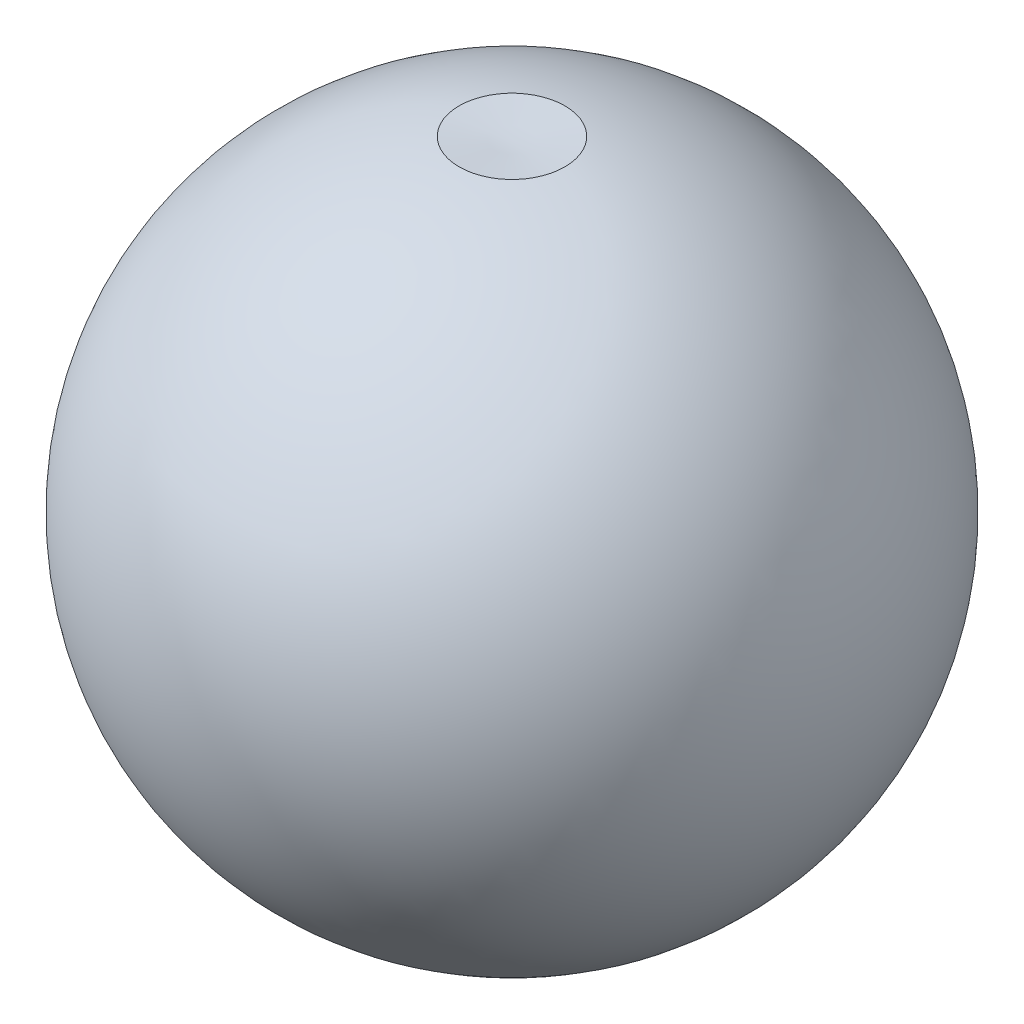
ISO-10303-21;
HEADER;
FILE_DESCRIPTION(('STEP AP214'),'2;1');
FILE_NAME('part.step','',(''),(''),'','','');
FILE_SCHEMA(('AUTOMOTIVE_DESIGN { 1 0 10303 214 1 1 1 1 }'));
ENDSEC;
DATA;
#1=APPLICATION_CONTEXT('core data for automotive mechanical design processes');
#2=APPLICATION_PROTOCOL_DEFINITION('international standard','automotive_design',2000,#1);
#3=PRODUCT_CONTEXT('',#1,'mechanical');
#4=PRODUCT('Part','Part','',(#3));
#5=PRODUCT_RELATED_PRODUCT_CATEGORY('part','',(#4));
#6=PRODUCT_DEFINITION_FORMATION('','',#4);
#7=PRODUCT_DEFINITION_CONTEXT('part definition',#1,'design');
#8=PRODUCT_DEFINITION('design','',#6,#7);
#9=PRODUCT_DEFINITION_SHAPE('','',#8);
#10=(LENGTH_UNIT() NAMED_UNIT(*) SI_UNIT(.MILLI.,.METRE.));
#11=(NAMED_UNIT(*) PLANE_ANGLE_UNIT() SI_UNIT($,.RADIAN.));
#12=(NAMED_UNIT(*) SI_UNIT($,.STERADIAN.) SOLID_ANGLE_UNIT());
#13=UNCERTAINTY_MEASURE_WITH_UNIT(LENGTH_MEASURE(1.E-05),#10,'distance_accuracy_value','');
#14=(GEOMETRIC_REPRESENTATION_CONTEXT(3) GLOBAL_UNCERTAINTY_ASSIGNED_CONTEXT((#13)) GLOBAL_UNIT_ASSIGNED_CONTEXT((#10,
#11,#12)) REPRESENTATION_CONTEXT('',''));
#15=CARTESIAN_POINT('',(0.,0.,0.));
#16=DIRECTION('',(0.,0.,1.));
#17=DIRECTION('',(1.,0.,0.));
#18=AXIS2_PLACEMENT_3D('',#15,#16,#17);
#19=CARTESIAN_POINT('',(0.,-30.,0.));
#20=DIRECTION('',(0.,1.,0.));
#21=DIRECTION('',(-1.,0.,0.));
#22=AXIS2_PLACEMENT_3D('',#19,#20,#21);
#23=PLANE('',#22);
#24=CARTESIAN_POINT('',(0.,-30.,0.));
#25=DIRECTION('',(0.,1.,0.));
#26=DIRECTION('',(-1.,0.,0.));
#27=AXIS2_PLACEMENT_3D('',#24,#25,#26);
#28=CIRCLE('',#27,4.87533777749147);
#29=CARTESIAN_POINT('',(4.87533777749144,-30.,0.));
#30=VERTEX_POINT('',#29);
#31=EDGE_CURVE('E11',#30,#30,#28,.T.);
#32=ORIENTED_EDGE('',*,*,#31,.F.);
#33=EDGE_LOOP('',(#32));
#34=FACE_BOUND('',#33,.T.);
#35=ADVANCED_FACE('F32',(#34),#23,.F.);
#36=CARTESIAN_POINT('',(0.,0.,0.));
#37=DIRECTION('',(0.,1.,0.));
#38=DIRECTION('',(1.,0.,0.));
#39=AXIS2_PLACEMENT_3D('',#36,#37,#38);
#40=SPHERICAL_SURFACE('',#39,30.3935670569388);
#41=CARTESIAN_POINT('',(0.,30.,0.));
#42=DIRECTION('',(0.,1.,0.));
#43=DIRECTION('',(-1.,0.,0.));
#44=AXIS2_PLACEMENT_3D('',#41,#42,#43);
#45=CIRCLE('',#44,4.8753377774915);
#46=CARTESIAN_POINT('',(4.87533777749148,30.,0.));
#47=VERTEX_POINT('',#46);
#48=EDGE_CURVE('E38',#47,#47,#45,.T.);
#49=CARTESIAN_POINT('',(4.87533777749148,30.,0.));
#50=CARTESIAN_POINT('',(5.31586836795734,29.9284157533238,0.));
#51=CARTESIAN_POINT('',(5.75481939059711,29.8471150206072,0.));
#52=CARTESIAN_POINT('',(6.62871671181679,29.6652677864923,0.));
#53=CARTESIAN_POINT('',(7.0636630103967,29.5647212850941,0.));
#54=CARTESIAN_POINT('',(7.92870529508897,29.3445697170153,0.));
#55=CARTESIAN_POINT('',(8.35880128120133,29.2249646503347,0.));
#56=CARTESIAN_POINT('',(9.21330884594772,28.9669301414478,0.));
#57=CARTESIAN_POINT('',(9.63772042458175,28.8285006992416,0.));
#58=CARTESIAN_POINT('',(10.4800355511774,28.5330854737222,0.));
#59=CARTESIAN_POINT('',(10.897939099139,28.3760996904091,0.));
#60=CARTESIAN_POINT('',(11.7264273185159,28.0438765412256,0.));
#61=CARTESIAN_POINT('',(12.1370119899311,27.8686391753553,0.));
#62=CARTESIAN_POINT('',(12.9500657714383,27.5002528414943,0.));
#63=CARTESIAN_POINT('',(13.3525348815302,27.3071038735037,0.));
#64=CARTESIAN_POINT('',(14.1485766133436,26.9032691221238,0.));
#65=CARTESIAN_POINT('',(14.5421492350649,26.6925833387345,0.));
#66=CARTESIAN_POINT('',(15.3196343224792,26.2540837569471,0.));
#67=CARTESIAN_POINT('',(15.7035467881722,26.0262699585489,0.));
#68=CARTESIAN_POINT('',(16.4609666406872,25.5539563851118,0.));
#69=CARTESIAN_POINT('',(16.8344740275092,25.3094566100728,0.));
#70=CARTESIAN_POINT('',(17.5703589886864,24.8042454972973,0.));
#71=CARTESIAN_POINT('',(17.9327365630416,24.5435341595608,0.));
#72=CARTESIAN_POINT('',(18.6456587614309,24.0064057916395,0.));
#73=CARTESIAN_POINT('',(18.9962033854651,23.7299887614549,0.));
#74=CARTESIAN_POINT('',(19.6847795053612,23.1619853532926,0.));
#75=CARTESIAN_POINT('',(20.0228110012231,22.8703989753151,0.));
#76=CARTESIAN_POINT('',(20.6857049667251,22.2726226500242,0.));
#77=CARTESIAN_POINT('',(21.0105674363651,21.966432702711,0.));
#78=CARTESIAN_POINT('',(21.6464930038397,21.3400433531777,0.));
#79=CARTESIAN_POINT('',(21.9575561016742,21.0198439509577,0.));
#80=CARTESIAN_POINT('',(22.5652793555097,20.3660569892306,0.));
#81=CARTESIAN_POINT('',(22.8619395115106,20.0324694297235,0.));
#82=CARTESIAN_POINT('',(23.4402812583412,19.3525534286987,0.));
#83=CARTESIAN_POINT('',(23.7219628491708,19.0062249871809,0.));
#84=CARTESIAN_POINT('',(24.2698009059192,18.3014992191301,0.));
#85=CARTESIAN_POINT('',(24.5359573718381,17.9431018925971,0.));
#86=CARTESIAN_POINT('',(25.0522287431393,17.2149337693238,0.));
#87=CARTESIAN_POINT('',(25.3023436485217,16.8451629725834,0.));
#88=CARTESIAN_POINT('',(25.7860465893014,16.0949653921703,0.));
#89=CARTESIAN_POINT('',(26.0196346246987,15.7145386084975,0.));
#90=CARTESIAN_POINT('',(26.4698305839056,14.9437672137957,0.));
#91=CARTESIAN_POINT('',(26.6864385077151,14.5534226027668,0.));
#92=CARTESIAN_POINT('',(27.1022539494343,13.7635729569452,0.));
#93=CARTESIAN_POINT('',(27.3014614673441,13.3640679221526,0.));
#94=CARTESIAN_POINT('',(27.6820895657595,12.5566726067876,0.));
#95=CARTESIAN_POINT('',(27.8635101462652,12.1487823262152,0.));
#96=CARTESIAN_POINT('',(28.2082123511803,11.3254079675524,0.));
#97=CARTESIAN_POINT('',(28.3714939755898,10.909923889462,0.));
#98=CARTESIAN_POINT('',(28.6796014454707,10.0721681186194,0.));
#99=CARTESIAN_POINT('',(28.8244272909423,9.64989642586709,0.));
#100=CARTESIAN_POINT('',(29.0953421907019,8.79938477887753,0.));
#101=CARTESIAN_POINT('',(29.22143124499,8.37114482464025,0.));
#102=CARTESIAN_POINT('',(29.4546279059946,7.50952758834968,0.));
#103=CARTESIAN_POINT('',(29.561735512711,7.0761503062964,0.));
#104=CARTESIAN_POINT('',(29.7567614527594,6.20509931623615,0.));
#105=CARTESIAN_POINT('',(29.8446797860912,5.76742560822918,0.));
#106=CARTESIAN_POINT('',(30.0011565873867,4.88863100467667,0.));
#107=CARTESIAN_POINT('',(30.0697150553502,4.44751010913112,0.));
#108=CARTESIAN_POINT('',(30.1873390987621,3.56267705765299,0.));
#109=CARTESIAN_POINT('',(30.2364046742105,3.11896490172041,0.));
#110=CARTESIAN_POINT('',(30.3149477284003,2.22981028456139,0.));
#111=CARTESIAN_POINT('',(30.3444252071419,1.78436782333496,0.));
#112=CARTESIAN_POINT('',(30.3837348714111,0.892616908072348,0.));
#113=CARTESIAN_POINT('',(30.3935670569388,0.446308454036166,0.));
#114=CARTESIAN_POINT('',(30.3935670569388,-0.446308454036199,0.));
#115=CARTESIAN_POINT('',(30.3837348714111,-0.892616908072381,0.));
#116=CARTESIAN_POINT('',(30.3444252071419,-1.78436782333499,0.));
#117=CARTESIAN_POINT('',(30.3149477284003,-2.22981028456142,0.));
#118=CARTESIAN_POINT('',(30.2364046742105,-3.11896490172044,0.));
#119=CARTESIAN_POINT('',(30.1873390987621,-3.56267705765302,0.));
#120=CARTESIAN_POINT('',(30.0697150553502,-4.44751010913116,0.));
#121=CARTESIAN_POINT('',(30.0011565873866,-4.88863100467671,0.));
#122=CARTESIAN_POINT('',(29.8446797860912,-5.76742560822922,0.));
#123=CARTESIAN_POINT('',(29.7567614527594,-6.20509931623618,0.));
#124=CARTESIAN_POINT('',(29.561735512711,-7.07615030629643,0.));
#125=CARTESIAN_POINT('',(29.4546279059946,-7.50952758834972,0.));
#126=CARTESIAN_POINT('',(29.22143124499,-8.37114482464028,0.));
#127=CARTESIAN_POINT('',(29.0953421907019,-8.79938477887756,0.));
#128=CARTESIAN_POINT('',(28.8244272909423,-9.64989642586712,0.));
#129=CARTESIAN_POINT('',(28.6796014454707,-10.0721681186194,0.));
#130=CARTESIAN_POINT('',(28.3714939755897,-10.9099238894621,0.));
#131=CARTESIAN_POINT('',(28.2082123511803,-11.3254079675525,0.));
#132=CARTESIAN_POINT('',(27.8635101462651,-12.1487823262152,0.));
#133=CARTESIAN_POINT('',(27.6820895657595,-12.5566726067876,0.));
#134=CARTESIAN_POINT('',(27.3014614673441,-13.3640679221526,0.));
#135=CARTESIAN_POINT('',(27.1022539494343,-13.7635729569452,0.));
#136=CARTESIAN_POINT('',(26.686438507715,-14.5534226027668,0.));
#137=CARTESIAN_POINT('',(26.4698305839056,-14.9437672137958,0.));
#138=CARTESIAN_POINT('',(26.0196346246987,-15.7145386084975,0.));
#139=CARTESIAN_POINT('',(25.7860465893013,-16.0949653921703,0.));
#140=CARTESIAN_POINT('',(25.3023436485216,-16.8451629725834,0.));
#141=CARTESIAN_POINT('',(25.0522287431393,-17.2149337693238,0.));
#142=CARTESIAN_POINT('',(24.5359573718381,-17.9431018925972,0.));
#143=CARTESIAN_POINT('',(24.2698009059192,-18.3014992191302,0.));
#144=CARTESIAN_POINT('',(23.7219628491708,-19.0062249871809,0.));
#145=CARTESIAN_POINT('',(23.4402812583412,-19.3525534286987,0.));
#146=CARTESIAN_POINT('',(22.8619395115106,-20.0324694297236,0.));
#147=CARTESIAN_POINT('',(22.5652793555096,-20.3660569892306,0.));
#148=CARTESIAN_POINT('',(21.9575561016742,-21.0198439509577,0.));
#149=CARTESIAN_POINT('',(21.6464930038397,-21.3400433531777,0.));
#150=CARTESIAN_POINT('',(21.0105674363651,-21.966432702711,0.));
#151=CARTESIAN_POINT('',(20.6857049667251,-22.2726226500242,0.));
#152=CARTESIAN_POINT('',(20.0228110012231,-22.8703989753151,0.));
#153=CARTESIAN_POINT('',(19.6847795053612,-23.1619853532926,0.));
#154=CARTESIAN_POINT('',(18.9962033854651,-23.7299887614549,0.));
#155=CARTESIAN_POINT('',(18.6456587614309,-24.0064057916395,0.));
#156=CARTESIAN_POINT('',(17.9327365630415,-24.5435341595608,0.));
#157=CARTESIAN_POINT('',(17.5703589886864,-24.8042454972973,0.));
#158=CARTESIAN_POINT('',(16.8344740275092,-25.3094566100729,0.));
#159=CARTESIAN_POINT('',(16.4609666406871,-25.5539563851118,0.));
#160=CARTESIAN_POINT('',(15.7035467881721,-26.0262699585489,0.));
#161=CARTESIAN_POINT('',(15.3196343224792,-26.2540837569471,0.));
#162=CARTESIAN_POINT('',(14.5421492350649,-26.6925833387345,0.));
#163=CARTESIAN_POINT('',(14.1485766133435,-26.9032691221238,0.));
#164=CARTESIAN_POINT('',(13.3525348815302,-27.3071038735037,0.));
#165=CARTESIAN_POINT('',(12.9500657714382,-27.5002528414943,0.));
#166=CARTESIAN_POINT('',(12.1370119899311,-27.8686391753553,0.));
#167=CARTESIAN_POINT('',(11.7264273185158,-28.0438765412257,0.));
#168=CARTESIAN_POINT('',(10.897939099139,-28.3760996904091,0.));
#169=CARTESIAN_POINT('',(10.4800355511774,-28.5330854737222,0.));
#170=CARTESIAN_POINT('',(9.63772042458171,-28.8285006992416,0.));
#171=CARTESIAN_POINT('',(9.21330884594769,-28.9669301414478,0.));
#172=CARTESIAN_POINT('',(8.3588012812013,-29.2249646503347,0.));
#173=CARTESIAN_POINT('',(7.92870529508894,-29.3445697170153,0.));
#174=CARTESIAN_POINT('',(7.06366301039666,-29.5647212850941,0.));
#175=CARTESIAN_POINT('',(6.62871671181675,-29.6652677864924,0.));
#176=CARTESIAN_POINT('',(5.75481939059708,-29.8471150206072,0.));
#177=CARTESIAN_POINT('',(5.3158683679573,-29.9284157533238,0.));
#178=CARTESIAN_POINT('',(4.87533777749144,-30.,0.));
#179=B_SPLINE_CURVE_WITH_KNOTS('',3,(#49,#50,#51,#52,#53,#54,#55,#56,#57,#58,#59,#60,#61,#62,
#63,#64,#65,#66,#67,#68,#69,#70,#71,#72,#73,#74,#75,#76,#77,#78,#79,#80,#81,#82,#83,#84,#85,#86,
#87,#88,#89,#90,#91,#92,#93,#94,#95,#96,#97,#98,#99,#100,#101,#102,#103,#104,#105,#106,#107,
#108,#109,#110,#111,#112,#113,#114,#115,#116,#117,#118,#119,#120,#121,#122,#123,#124,#125,#126,
#127,#128,#129,#130,#131,#132,#133,#134,#135,#136,#137,#138,#139,#140,#141,#142,#143,#144,#145,
#146,#147,#148,#149,#150,#151,#152,#153,#154,#155,#156,#157,#158,#159,#160,#161,#162,#163,#164,
#165,#166,#167,#168,#169,#170,#171,#172,#173,#174,#175,#176,#177,#178),.UNSPECIFIED.,.F.,.F.,(4,
2,2,2,2,2,2,2,2,2,2,2,2,2,2,2,2,2,2,2,2,2,2,2,2,2,2,2,2,2,2,2,2,2,2,2,2,2,2,2,2,2,2,2,2,2,2,2,2,
2,2,2,2,2,2,2,2,2,2,2,2,2,2,2,4),(0.,1.33881712614443,2.67763425228886,4.01645137843329,
5.35526850457771,6.69408563072214,8.03290275686657,9.37171988301101,10.7105370091554,
12.0493541352999,13.3881712614443,14.7269883875887,16.0658055137332,17.4046226398776,
18.743439766022,20.0822568921664,21.4210740183109,22.7598911444553,24.0987082705997,
25.4375253967442,26.7763425228886,28.115159649033,29.4539767751774,30.7927939013219,
32.1316110274663,33.4704281536107,34.8092452797552,36.1480624058996,37.486879532044,
38.8256966581884,40.1645137843329,41.5033309104773,42.8421480366217,44.1809651627662,
45.5197822889106,46.858599415055,48.1974165411994,49.5362336673439,50.8750507934883,
52.2138679196327,53.5526850457772,54.8915021719216,56.230319298066,57.5691364242104,
58.9079535503549,60.2467706764993,61.5855878026437,62.9244049287881,64.2632220549326,
65.602039181077,66.9408563072215,68.2796734333659,69.6184905595103,70.9573076856547,
72.2961248117992,73.6349419379436,74.973759064088,76.3125761902325,77.6513933163769,
78.9902104425213,80.3290275686658,81.6678446948102,83.0066618209546,84.3454789470991,
85.6842960732435),.UNSPECIFIED.);
#180=EDGE_CURVE('BSEAM44',#47,#30,#179,.T.);
#181=ORIENTED_EDGE('',*,*,#48,.F.);
#182=ORIENTED_EDGE('',*,*,#31,.T.);
#183=ORIENTED_EDGE('',*,*,#180,.T.);
#184=ORIENTED_EDGE('',*,*,#180,.F.);
#185=EDGE_LOOP('',(#181,#183,#182,#184));
#186=FACE_BOUND('',#185,.T.);
#187=ADVANCED_FACE('F44',(#186),#40,.T.);
#188=CARTESIAN_POINT('',(0.,30.,0.));
#189=DIRECTION('',(0.,1.,0.));
#190=DIRECTION('',(-1.,0.,0.));
#191=AXIS2_PLACEMENT_3D('',#188,#189,#190);
#192=CONICAL_SURFACE('',#191,4.8753377774915,1.48494184085255);
#193=CARTESIAN_POINT('',(0.,29.5803989154981,0.));
#194=VERTEX_POINT('',#193);
#195=VERTEX_LOOP('',#194);
#196=FACE_BOUND('',#195,.T.);
#197=ORIENTED_EDGE('',*,*,#48,.T.);
#198=EDGE_LOOP('',(#197));
#199=FACE_BOUND('',#198,.T.);
#200=ADVANCED_FACE('F41',(#196,#199),#192,.F.);
#201=CLOSED_SHELL('',(#35,#187,#200));
#202=MANIFOLD_SOLID_BREP('B2',#201);
#203=ADVANCED_BREP_SHAPE_REPRESENTATION('',(#18,#202),#14);
#204=SHAPE_DEFINITION_REPRESENTATION(#9,#203);
ENDSEC;
END-ISO-10303-21;
